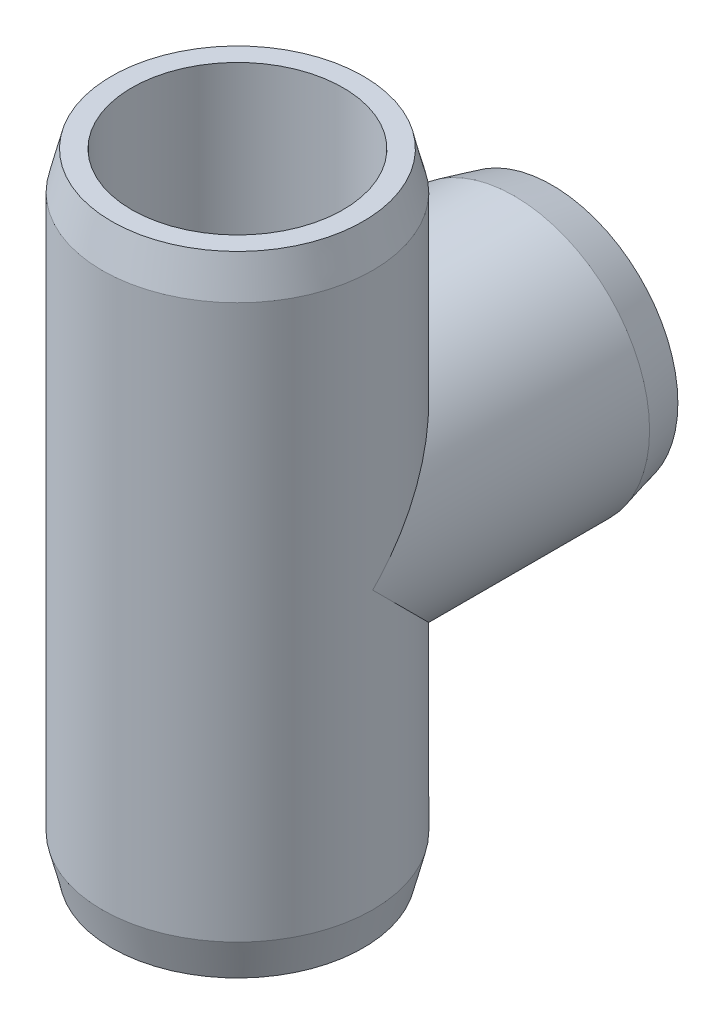
ISO-10303-21;
HEADER;
FILE_DESCRIPTION(('STEP AP214'),'2;1');
FILE_NAME('part.step','',(''),(''),'','','');
FILE_SCHEMA(('AUTOMOTIVE_DESIGN { 1 0 10303 214 1 1 1 1 }'));
ENDSEC;
DATA;
#1=APPLICATION_CONTEXT('core data for automotive mechanical design processes');
#2=APPLICATION_PROTOCOL_DEFINITION('international standard','automotive_design',2000,#1);
#3=PRODUCT_CONTEXT('',#1,'mechanical');
#4=PRODUCT('Part','Part','',(#3));
#5=PRODUCT_RELATED_PRODUCT_CATEGORY('part','',(#4));
#6=PRODUCT_DEFINITION_FORMATION('','',#4);
#7=PRODUCT_DEFINITION_CONTEXT('part definition',#1,'design');
#8=PRODUCT_DEFINITION('design','',#6,#7);
#9=PRODUCT_DEFINITION_SHAPE('','',#8);
#10=(LENGTH_UNIT() NAMED_UNIT(*) SI_UNIT(.MILLI.,.METRE.));
#11=(NAMED_UNIT(*) PLANE_ANGLE_UNIT() SI_UNIT($,.RADIAN.));
#12=(NAMED_UNIT(*) SI_UNIT($,.STERADIAN.) SOLID_ANGLE_UNIT());
#13=UNCERTAINTY_MEASURE_WITH_UNIT(LENGTH_MEASURE(1.E-05),#10,'distance_accuracy_value','');
#14=(GEOMETRIC_REPRESENTATION_CONTEXT(3) GLOBAL_UNCERTAINTY_ASSIGNED_CONTEXT((#13)) GLOBAL_UNIT_ASSIGNED_CONTEXT((#10,
#11,#12)) REPRESENTATION_CONTEXT('',''));
#15=CARTESIAN_POINT('',(0.,0.,0.));
#16=DIRECTION('',(0.,0.,1.));
#17=DIRECTION('',(1.,0.,0.));
#18=AXIS2_PLACEMENT_3D('',#15,#16,#17);
#19=CARTESIAN_POINT('',(0.,31.75,13.6535));
#20=DIRECTION('',(0.,0.,-1.));
#21=DIRECTION('',(-1.,0.,0.));
#22=AXIS2_PLACEMENT_3D('',#19,#20,#21);
#23=CYLINDRICAL_SURFACE('',#22,13.6525);
#24=CARTESIAN_POINT('',(0.,31.75,0.));
#25=DIRECTION('',(0.,-0.707106781186547,-0.707106781186547));
#26=DIRECTION('',(0.,0.707106781186547,-0.707106781186547));
#27=AXIS2_PLACEMENT_3D('',#24,#25,#26);
#28=ELLIPSE('',#27,19.3075506602987,13.6525);
#29=CARTESIAN_POINT('',(13.6525,31.75,0.));
#30=VERTEX_POINT('',#29);
#31=CARTESIAN_POINT('',(-13.6525,31.75,0.));
#32=VERTEX_POINT('',#31);
#33=EDGE_CURVE('E59',#30,#32,#28,.F.);
#34=ORIENTED_EDGE('',*,*,#33,.F.);
#35=CARTESIAN_POINT('',(0.,31.75,0.));
#36=DIRECTION('',(0.,0.707106781186547,-0.707106781186547));
#37=DIRECTION('',(0.,-0.707106781186547,-0.707106781186547));
#38=AXIS2_PLACEMENT_3D('',#35,#36,#37);
#39=ELLIPSE('',#38,19.3075506602987,13.6525);
#40=EDGE_CURVE('E47',#32,#30,#39,.F.);
#41=ORIENTED_EDGE('',*,*,#40,.F.);
#42=EDGE_LOOP('',(#34,#41));
#43=FACE_BOUND('',#42,.T.);
#44=CARTESIAN_POINT('',(0.,31.75,-27.94));
#45=DIRECTION('',(0.,0.,-1.));
#46=DIRECTION('',(-1.,0.,0.));
#47=AXIS2_PLACEMENT_3D('',#44,#45,#46);
#48=CIRCLE('',#47,13.6525);
#49=CARTESIAN_POINT('',(-13.6525,31.75,-27.94));
#50=VERTEX_POINT('',#49);
#51=EDGE_CURVE('E156',#50,#50,#48,.T.);
#52=ORIENTED_EDGE('',*,*,#51,.F.);
#53=EDGE_LOOP('',(#52));
#54=FACE_BOUND('',#53,.T.);
#55=ADVANCED_FACE('F33',(#43,#54),#23,.T.);
#56=CARTESIAN_POINT('',(0.,31.75,-31.75));
#57=DIRECTION('',(0.,0.,1.));
#58=DIRECTION('',(1.,0.,0.));
#59=AXIS2_PLACEMENT_3D('',#56,#57,#58);
#60=PLANE('',#59);
#61=CARTESIAN_POINT('',(0.,31.75,-31.75));
#62=DIRECTION('',(0.,0.,1.));
#63=DIRECTION('',(1.,0.,0.));
#64=AXIS2_PLACEMENT_3D('',#61,#62,#63);
#65=CIRCLE('',#64,10.668);
#66=CARTESIAN_POINT('',(10.668,31.75,-31.75));
#67=VERTEX_POINT('',#66);
#68=EDGE_CURVE('E61',#67,#67,#65,.T.);
#69=ORIENTED_EDGE('',*,*,#68,.T.);
#70=EDGE_LOOP('',(#69));
#71=FACE_BOUND('',#70,.T.);
#72=CARTESIAN_POINT('',(0.,31.75,-31.75));
#73=DIRECTION('',(0.,0.,-1.));
#74=DIRECTION('',(-1.,0.,0.));
#75=AXIS2_PLACEMENT_3D('',#72,#73,#74);
#76=CIRCLE('',#75,12.7);
#77=CARTESIAN_POINT('',(-12.7,31.75,-31.75));
#78=VERTEX_POINT('',#77);
#79=EDGE_CURVE('E159',#78,#78,#76,.T.);
#80=ORIENTED_EDGE('',*,*,#79,.T.);
#81=EDGE_LOOP('',(#80));
#82=FACE_BOUND('',#81,.T.);
#83=ADVANCED_FACE('F96',(#71,#82),#60,.F.);
#84=CARTESIAN_POINT('',(0.,63.5,0.));
#85=DIRECTION('',(0.,-1.,0.));
#86=DIRECTION('',(0.,0.,-1.));
#87=AXIS2_PLACEMENT_3D('',#84,#85,#86);
#88=CYLINDRICAL_SURFACE('',#87,10.668);
#89=CARTESIAN_POINT('',(0.,42.545,0.));
#90=DIRECTION('',(0.,1.,0.));
#91=DIRECTION('',(0.,0.,1.));
#92=AXIS2_PLACEMENT_3D('',#89,#90,#91);
#93=CIRCLE('',#92,10.668);
#94=CARTESIAN_POINT('',(0.,42.545,10.668));
#95=VERTEX_POINT('',#94);
#96=EDGE_CURVE('E197',#95,#95,#93,.T.);
#97=ORIENTED_EDGE('',*,*,#96,.T.);
#98=EDGE_LOOP('',(#97));
#99=FACE_BOUND('',#98,.T.);
#100=CARTESIAN_POINT('',(0.,31.75,0.));
#101=DIRECTION('',(0.,-0.707106781186547,0.707106781186547));
#102=DIRECTION('',(0.,-0.707106781186547,-0.707106781186547));
#103=AXIS2_PLACEMENT_3D('',#100,#101,#102);
#104=ELLIPSE('',#103,15.0868302833962,10.668);
#105=CARTESIAN_POINT('',(-10.668,31.75,0.));
#106=VERTEX_POINT('',#105);
#107=CARTESIAN_POINT('',(10.668,31.75,0.));
#108=VERTEX_POINT('',#107);
#109=EDGE_CURVE('E54',#106,#108,#104,.T.);
#110=ORIENTED_EDGE('',*,*,#109,.F.);
#111=CARTESIAN_POINT('',(0.,31.75,0.));
#112=DIRECTION('',(0.,-0.707106781186547,-0.707106781186547));
#113=DIRECTION('',(0.,-0.707106781186547,0.707106781186547));
#114=AXIS2_PLACEMENT_3D('',#111,#112,#113);
#115=ELLIPSE('',#114,15.0868302833962,10.668);
#116=EDGE_CURVE('E72',#108,#106,#115,.F.);
#117=ORIENTED_EDGE('',*,*,#116,.F.);
#118=EDGE_LOOP('',(#110,#117));
#119=FACE_BOUND('',#118,.T.);
#120=CARTESIAN_POINT('',(0.,20.955,0.));
#121=DIRECTION('',(0.,-1.,0.));
#122=DIRECTION('',(0.,0.,-1.));
#123=AXIS2_PLACEMENT_3D('',#120,#121,#122);
#124=CIRCLE('',#123,10.668);
#125=CARTESIAN_POINT('',(0.,20.955,-10.668));
#126=VERTEX_POINT('',#125);
#127=EDGE_CURVE('E185',#126,#126,#124,.T.);
#128=ORIENTED_EDGE('',*,*,#127,.T.);
#129=EDGE_LOOP('',(#128));
#130=FACE_BOUND('',#129,.T.);
#131=ADVANCED_FACE('F100',(#99,#119,#130),#88,.F.);
#132=CARTESIAN_POINT('',(0.,0.,0.));
#133=DIRECTION('',(0.,1.,0.));
#134=DIRECTION('',(0.,0.,1.));
#135=AXIS2_PLACEMENT_3D('',#132,#133,#134);
#136=CIRCLE('',#135,10.668);
#137=CARTESIAN_POINT('',(0.,0.,10.668));
#138=VERTEX_POINT('',#137);
#139=EDGE_CURVE('E64',#138,#138,#136,.T.);
#140=ORIENTED_EDGE('',*,*,#139,.F.);
#141=EDGE_LOOP('',(#140));
#142=FACE_BOUND('',#141,.T.);
#143=CARTESIAN_POINT('',(0.,19.05,0.));
#144=DIRECTION('',(0.,-1.,0.));
#145=DIRECTION('',(0.,0.,-1.));
#146=AXIS2_PLACEMENT_3D('',#143,#144,#145);
#147=CIRCLE('',#146,10.668);
#148=CARTESIAN_POINT('',(0.,19.05,-10.668));
#149=VERTEX_POINT('',#148);
#150=EDGE_CURVE('E176',#149,#149,#147,.T.);
#151=ORIENTED_EDGE('',*,*,#150,.F.);
#152=EDGE_LOOP('',(#151));
#153=FACE_BOUND('',#152,.T.);
#154=ADVANCED_FACE('F221',(#142,#153),#88,.F.);
#155=CARTESIAN_POINT('',(0.,63.5,0.));
#156=DIRECTION('',(0.,1.,0.));
#157=DIRECTION('',(0.,0.,1.));
#158=AXIS2_PLACEMENT_3D('',#155,#156,#157);
#159=CIRCLE('',#158,10.668);
#160=CARTESIAN_POINT('',(0.,63.5,10.668));
#161=VERTEX_POINT('',#160);
#162=EDGE_CURVE('E67',#161,#161,#159,.T.);
#163=ORIENTED_EDGE('',*,*,#162,.T.);
#164=EDGE_LOOP('',(#163));
#165=FACE_BOUND('',#164,.T.);
#166=CARTESIAN_POINT('',(0.,44.45,0.));
#167=DIRECTION('',(0.,1.,0.));
#168=DIRECTION('',(0.,0.,1.));
#169=AXIS2_PLACEMENT_3D('',#166,#167,#168);
#170=CIRCLE('',#169,10.668);
#171=CARTESIAN_POINT('',(0.,44.45,10.668));
#172=VERTEX_POINT('',#171);
#173=EDGE_CURVE('E188',#172,#172,#170,.T.);
#174=ORIENTED_EDGE('',*,*,#173,.F.);
#175=EDGE_LOOP('',(#174));
#176=FACE_BOUND('',#175,.T.);
#177=ADVANCED_FACE('F91',(#165,#176),#88,.F.);
#178=CARTESIAN_POINT('',(0.,31.75,-69.85));
#179=DIRECTION('',(0.,0.,1.));
#180=DIRECTION('',(1.,0.,0.));
#181=AXIS2_PLACEMENT_3D('',#178,#179,#180);
#182=CYLINDRICAL_SURFACE('',#181,10.668);
#183=ORIENTED_EDGE('',*,*,#109,.T.);
#184=ORIENTED_EDGE('',*,*,#116,.T.);
#185=EDGE_LOOP('',(#183,#184));
#186=FACE_BOUND('',#185,.T.);
#187=CARTESIAN_POINT('',(0.,31.75,-10.795));
#188=DIRECTION('',(0.,0.,-1.));
#189=DIRECTION('',(0.,1.,0.));
#190=AXIS2_PLACEMENT_3D('',#187,#188,#189);
#191=CIRCLE('',#190,10.668);
#192=CARTESIAN_POINT('',(0.,42.418,-10.795));
#193=VERTEX_POINT('',#192);
#194=EDGE_CURVE('E11',#193,#193,#191,.F.);
#195=ORIENTED_EDGE('',*,*,#194,.F.);
#196=EDGE_LOOP('',(#195));
#197=FACE_BOUND('',#196,.T.);
#198=ADVANCED_FACE('F82',(#186,#197),#182,.F.);
#199=ORIENTED_EDGE('',*,*,#68,.F.);
#200=EDGE_LOOP('',(#199));
#201=FACE_BOUND('',#200,.T.);
#202=CARTESIAN_POINT('',(0.,31.75,-12.7));
#203=DIRECTION('',(0.,0.,1.));
#204=DIRECTION('',(0.,-1.,0.));
#205=AXIS2_PLACEMENT_3D('',#202,#203,#204);
#206=CIRCLE('',#205,10.668);
#207=CARTESIAN_POINT('',(0.,21.082,-12.7));
#208=VERTEX_POINT('',#207);
#209=EDGE_CURVE('E41',#208,#208,#206,.F.);
#210=ORIENTED_EDGE('',*,*,#209,.F.);
#211=EDGE_LOOP('',(#210));
#212=FACE_BOUND('',#211,.T.);
#213=ADVANCED_FACE('F80',(#201,#212),#182,.F.);
#214=CARTESIAN_POINT('',(0.,63.5,0.));
#215=DIRECTION('',(0.,-1.,0.));
#216=DIRECTION('',(0.,0.,-1.));
#217=AXIS2_PLACEMENT_3D('',#214,#215,#216);
#218=CYLINDRICAL_SURFACE('',#217,13.6525);
#219=CARTESIAN_POINT('',(0.,59.69,0.));
#220=DIRECTION('',(0.,-1.,0.));
#221=DIRECTION('',(0.,0.,-1.));
#222=AXIS2_PLACEMENT_3D('',#219,#220,#221);
#223=CIRCLE('',#222,13.6525);
#224=CARTESIAN_POINT('',(0.,59.69,-13.6525));
#225=VERTEX_POINT('',#224);
#226=EDGE_CURVE('E161',#225,#225,#223,.T.);
#227=ORIENTED_EDGE('',*,*,#226,.T.);
#228=EDGE_LOOP('',(#227));
#229=FACE_BOUND('',#228,.T.);
#230=CARTESIAN_POINT('',(0.,3.81,0.));
#231=DIRECTION('',(0.,-1.,0.));
#232=DIRECTION('',(0.,0.,-1.));
#233=AXIS2_PLACEMENT_3D('',#230,#231,#232);
#234=CIRCLE('',#233,13.6525);
#235=CARTESIAN_POINT('',(0.,3.81,-13.6525));
#236=VERTEX_POINT('',#235);
#237=EDGE_CURVE('E170',#236,#236,#234,.T.);
#238=ORIENTED_EDGE('',*,*,#237,.F.);
#239=EDGE_LOOP('',(#238));
#240=FACE_BOUND('',#239,.T.);
#241=ORIENTED_EDGE('',*,*,#33,.T.);
#242=ORIENTED_EDGE('',*,*,#40,.T.);
#243=EDGE_LOOP('',(#241,#242));
#244=FACE_BOUND('',#243,.T.);
#245=ADVANCED_FACE('F35',(#229,#240,#244),#218,.T.);
#246=CARTESIAN_POINT('',(0.,63.5,0.));
#247=DIRECTION('',(0.,1.,0.));
#248=DIRECTION('',(0.,0.,1.));
#249=AXIS2_PLACEMENT_3D('',#246,#247,#248);
#250=PLANE('',#249);
#251=CARTESIAN_POINT('',(0.,63.5,0.));
#252=DIRECTION('',(0.,-1.,0.));
#253=DIRECTION('',(0.,0.,-1.));
#254=AXIS2_PLACEMENT_3D('',#251,#252,#253);
#255=CIRCLE('',#254,12.7);
#256=CARTESIAN_POINT('',(0.,63.5,-12.7));
#257=VERTEX_POINT('',#256);
#258=EDGE_CURVE('E164',#257,#257,#255,.T.);
#259=ORIENTED_EDGE('',*,*,#258,.F.);
#260=EDGE_LOOP('',(#259));
#261=FACE_BOUND('',#260,.T.);
#262=ORIENTED_EDGE('',*,*,#162,.F.);
#263=EDGE_LOOP('',(#262));
#264=FACE_BOUND('',#263,.T.);
#265=ADVANCED_FACE('F89',(#261,#264),#250,.T.);
#266=CARTESIAN_POINT('',(0.,0.,0.));
#267=DIRECTION('',(0.,1.,0.));
#268=DIRECTION('',(0.,0.,1.));
#269=AXIS2_PLACEMENT_3D('',#266,#267,#268);
#270=PLANE('',#269);
#271=CARTESIAN_POINT('',(0.,0.,0.));
#272=DIRECTION('',(0.,-1.,0.));
#273=DIRECTION('',(0.,0.,-1.));
#274=AXIS2_PLACEMENT_3D('',#271,#272,#273);
#275=CIRCLE('',#274,12.7);
#276=CARTESIAN_POINT('',(0.,0.,-12.7));
#277=VERTEX_POINT('',#276);
#278=EDGE_CURVE('E173',#277,#277,#275,.T.);
#279=ORIENTED_EDGE('',*,*,#278,.T.);
#280=EDGE_LOOP('',(#279));
#281=FACE_BOUND('',#280,.T.);
#282=ORIENTED_EDGE('',*,*,#139,.T.);
#283=EDGE_LOOP('',(#282));
#284=FACE_BOUND('',#283,.T.);
#285=ADVANCED_FACE('F108',(#281,#284),#270,.F.);
#286=CARTESIAN_POINT('',(0.,21.082,-10.795));
#287=DIRECTION('',(0.,0.,-1.));
#288=DIRECTION('',(0.,1.,0.));
#289=AXIS2_PLACEMENT_3D('',#286,#287,#288);
#290=PLANE('',#289);
#291=ORIENTED_EDGE('',*,*,#194,.T.);
#292=EDGE_LOOP('',(#291));
#293=FACE_BOUND('',#292,.T.);
#294=CARTESIAN_POINT('',(0.,31.75,-10.795));
#295=DIRECTION('',(0.,0.,-1.));
#296=DIRECTION('',(0.,1.,0.));
#297=AXIS2_PLACEMENT_3D('',#294,#295,#296);
#298=CIRCLE('',#297,9.39799999999999);
#299=CARTESIAN_POINT('',(0.,41.148,-10.795));
#300=VERTEX_POINT('',#299);
#301=EDGE_CURVE('E203',#300,#300,#298,.T.);
#302=ORIENTED_EDGE('',*,*,#301,.T.);
#303=EDGE_LOOP('',(#302));
#304=FACE_BOUND('',#303,.T.);
#305=ADVANCED_FACE('F104',(#293,#304),#290,.F.);
#306=CARTESIAN_POINT('',(0.,31.75,-31.75));
#307=DIRECTION('',(0.,0.,-1.));
#308=DIRECTION('',(0.,1.,0.));
#309=AXIS2_PLACEMENT_3D('',#306,#307,#308);
#310=CYLINDRICAL_SURFACE('',#309,9.39799999999999);
#311=ORIENTED_EDGE('',*,*,#301,.F.);
#312=EDGE_LOOP('',(#311));
#313=FACE_BOUND('',#312,.T.);
#314=CARTESIAN_POINT('',(0.,31.75,-12.7));
#315=DIRECTION('',(0.,0.,-1.));
#316=DIRECTION('',(0.,1.,0.));
#317=AXIS2_PLACEMENT_3D('',#314,#315,#316);
#318=CIRCLE('',#317,9.39799999999999);
#319=CARTESIAN_POINT('',(0.,41.148,-12.7));
#320=VERTEX_POINT('',#319);
#321=EDGE_CURVE('E200',#320,#320,#318,.T.);
#322=ORIENTED_EDGE('',*,*,#321,.T.);
#323=EDGE_LOOP('',(#322));
#324=FACE_BOUND('',#323,.T.);
#325=ADVANCED_FACE('F107',(#313,#324),#310,.F.);
#326=CARTESIAN_POINT('',(0.,22.352,-12.7));
#327=DIRECTION('',(0.,0.,1.));
#328=DIRECTION('',(0.,-1.,0.));
#329=AXIS2_PLACEMENT_3D('',#326,#327,#328);
#330=PLANE('',#329);
#331=ORIENTED_EDGE('',*,*,#321,.F.);
#332=EDGE_LOOP('',(#331));
#333=FACE_BOUND('',#332,.T.);
#334=ORIENTED_EDGE('',*,*,#209,.T.);
#335=EDGE_LOOP('',(#334));
#336=FACE_BOUND('',#335,.T.);
#337=ADVANCED_FACE('F78',(#333,#336),#330,.F.);
#338=CARTESIAN_POINT('',(0.,42.545,-10.668));
#339=DIRECTION('',(0.,1.,0.));
#340=DIRECTION('',(0.,0.,1.));
#341=AXIS2_PLACEMENT_3D('',#338,#339,#340);
#342=PLANE('',#341);
#343=ORIENTED_EDGE('',*,*,#96,.F.);
#344=EDGE_LOOP('',(#343));
#345=FACE_BOUND('',#344,.T.);
#346=CARTESIAN_POINT('',(0.,42.545,0.));
#347=DIRECTION('',(0.,1.,0.));
#348=DIRECTION('',(0.,0.,1.));
#349=AXIS2_PLACEMENT_3D('',#346,#347,#348);
#350=CIRCLE('',#349,9.398);
#351=CARTESIAN_POINT('',(0.,42.545,9.398));
#352=VERTEX_POINT('',#351);
#353=EDGE_CURVE('E194',#352,#352,#350,.T.);
#354=ORIENTED_EDGE('',*,*,#353,.T.);
#355=EDGE_LOOP('',(#354));
#356=FACE_BOUND('',#355,.T.);
#357=ADVANCED_FACE('F115',(#345,#356),#342,.F.);
#358=CARTESIAN_POINT('',(0.,63.5,0.));
#359=DIRECTION('',(0.,1.,0.));
#360=DIRECTION('',(0.,0.,1.));
#361=AXIS2_PLACEMENT_3D('',#358,#359,#360);
#362=CYLINDRICAL_SURFACE('',#361,9.398);
#363=ORIENTED_EDGE('',*,*,#353,.F.);
#364=EDGE_LOOP('',(#363));
#365=FACE_BOUND('',#364,.T.);
#366=CARTESIAN_POINT('',(0.,44.45,0.));
#367=DIRECTION('',(0.,1.,0.));
#368=DIRECTION('',(0.,0.,1.));
#369=AXIS2_PLACEMENT_3D('',#366,#367,#368);
#370=CIRCLE('',#369,9.398);
#371=CARTESIAN_POINT('',(0.,44.45,9.398));
#372=VERTEX_POINT('',#371);
#373=EDGE_CURVE('E191',#372,#372,#370,.T.);
#374=ORIENTED_EDGE('',*,*,#373,.T.);
#375=EDGE_LOOP('',(#374));
#376=FACE_BOUND('',#375,.T.);
#377=ADVANCED_FACE('F119',(#365,#376),#362,.F.);
#378=CARTESIAN_POINT('',(0.,44.45,-9.398));
#379=DIRECTION('',(0.,-1.,0.));
#380=DIRECTION('',(0.,0.,-1.));
#381=AXIS2_PLACEMENT_3D('',#378,#379,#380);
#382=PLANE('',#381);
#383=ORIENTED_EDGE('',*,*,#373,.F.);
#384=EDGE_LOOP('',(#383));
#385=FACE_BOUND('',#384,.T.);
#386=ORIENTED_EDGE('',*,*,#173,.T.);
#387=EDGE_LOOP('',(#386));
#388=FACE_BOUND('',#387,.T.);
#389=ADVANCED_FACE('F123',(#385,#388),#382,.F.);
#390=CARTESIAN_POINT('',(0.,20.955,10.668));
#391=DIRECTION('',(0.,-1.,0.));
#392=DIRECTION('',(0.,0.,-1.));
#393=AXIS2_PLACEMENT_3D('',#390,#391,#392);
#394=PLANE('',#393);
#395=ORIENTED_EDGE('',*,*,#127,.F.);
#396=EDGE_LOOP('',(#395));
#397=FACE_BOUND('',#396,.T.);
#398=CARTESIAN_POINT('',(0.,20.955,0.));
#399=DIRECTION('',(0.,-1.,0.));
#400=DIRECTION('',(0.,0.,-1.));
#401=AXIS2_PLACEMENT_3D('',#398,#399,#400);
#402=CIRCLE('',#401,9.398);
#403=CARTESIAN_POINT('',(0.,20.955,-9.398));
#404=VERTEX_POINT('',#403);
#405=EDGE_CURVE('E182',#404,#404,#402,.T.);
#406=ORIENTED_EDGE('',*,*,#405,.T.);
#407=EDGE_LOOP('',(#406));
#408=FACE_BOUND('',#407,.T.);
#409=ADVANCED_FACE('F127',(#397,#408),#394,.F.);
#410=CARTESIAN_POINT('',(0.,0.,0.));
#411=DIRECTION('',(0.,-1.,0.));
#412=DIRECTION('',(0.,0.,-1.));
#413=AXIS2_PLACEMENT_3D('',#410,#411,#412);
#414=CYLINDRICAL_SURFACE('',#413,9.398);
#415=ORIENTED_EDGE('',*,*,#405,.F.);
#416=EDGE_LOOP('',(#415));
#417=FACE_BOUND('',#416,.T.);
#418=CARTESIAN_POINT('',(0.,19.05,0.));
#419=DIRECTION('',(0.,-1.,0.));
#420=DIRECTION('',(0.,0.,-1.));
#421=AXIS2_PLACEMENT_3D('',#418,#419,#420);
#422=CIRCLE('',#421,9.398);
#423=CARTESIAN_POINT('',(0.,19.05,-9.398));
#424=VERTEX_POINT('',#423);
#425=EDGE_CURVE('E179',#424,#424,#422,.T.);
#426=ORIENTED_EDGE('',*,*,#425,.T.);
#427=EDGE_LOOP('',(#426));
#428=FACE_BOUND('',#427,.T.);
#429=ADVANCED_FACE('F131',(#417,#428),#414,.F.);
#430=CARTESIAN_POINT('',(0.,19.05,9.398));
#431=DIRECTION('',(0.,1.,0.));
#432=DIRECTION('',(0.,0.,1.));
#433=AXIS2_PLACEMENT_3D('',#430,#431,#432);
#434=PLANE('',#433);
#435=ORIENTED_EDGE('',*,*,#425,.F.);
#436=EDGE_LOOP('',(#435));
#437=FACE_BOUND('',#436,.T.);
#438=ORIENTED_EDGE('',*,*,#150,.T.);
#439=EDGE_LOOP('',(#438));
#440=FACE_BOUND('',#439,.T.);
#441=ADVANCED_FACE('F135',(#437,#440),#434,.F.);
#442=CARTESIAN_POINT('',(0.,3.81,0.));
#443=DIRECTION('',(0.,1.,0.));
#444=DIRECTION('',(0.,0.,1.));
#445=AXIS2_PLACEMENT_3D('',#442,#443,#444);
#446=CONICAL_SURFACE('',#445,13.6525,0.244978663126864);
#447=ORIENTED_EDGE('',*,*,#278,.F.);
#448=EDGE_LOOP('',(#447));
#449=FACE_BOUND('',#448,.T.);
#450=ORIENTED_EDGE('',*,*,#237,.T.);
#451=EDGE_LOOP('',(#450));
#452=FACE_BOUND('',#451,.T.);
#453=ADVANCED_FACE('F139',(#449,#452),#446,.T.);
#454=CARTESIAN_POINT('',(0.,59.69,0.));
#455=DIRECTION('',(0.,-1.,0.));
#456=DIRECTION('',(0.,0.,1.));
#457=AXIS2_PLACEMENT_3D('',#454,#455,#456);
#458=CONICAL_SURFACE('',#457,13.6525,0.244978663126864);
#459=ORIENTED_EDGE('',*,*,#258,.T.);
#460=EDGE_LOOP('',(#459));
#461=FACE_BOUND('',#460,.T.);
#462=ORIENTED_EDGE('',*,*,#226,.F.);
#463=EDGE_LOOP('',(#462));
#464=FACE_BOUND('',#463,.T.);
#465=ADVANCED_FACE('F143',(#461,#464),#458,.T.);
#466=CARTESIAN_POINT('',(0.,31.75,-31.75));
#467=DIRECTION('',(0.,0.,1.));
#468=DIRECTION('',(1.,0.,0.));
#469=AXIS2_PLACEMENT_3D('',#466,#467,#468);
#470=CONICAL_SURFACE('',#469,12.7,0.244978663126864);
#471=ORIENTED_EDGE('',*,*,#51,.T.);
#472=EDGE_LOOP('',(#471));
#473=FACE_BOUND('',#472,.T.);
#474=ORIENTED_EDGE('',*,*,#79,.F.);
#475=EDGE_LOOP('',(#474));
#476=FACE_BOUND('',#475,.T.);
#477=ADVANCED_FACE('F147',(#473,#476),#470,.T.);
#478=CLOSED_SHELL('',(#55,#83,#131,#154,#177,#198,#213,#245,#265,#285,#305,#325,#337,#357,#377,
#389,#409,#429,#441,#453,#465,#477));
#479=MANIFOLD_SOLID_BREP('B2',#478);
#480=ADVANCED_BREP_SHAPE_REPRESENTATION('',(#18,#479),#14);
#481=SHAPE_DEFINITION_REPRESENTATION(#9,#480);
ENDSEC;
END-ISO-10303-21;
